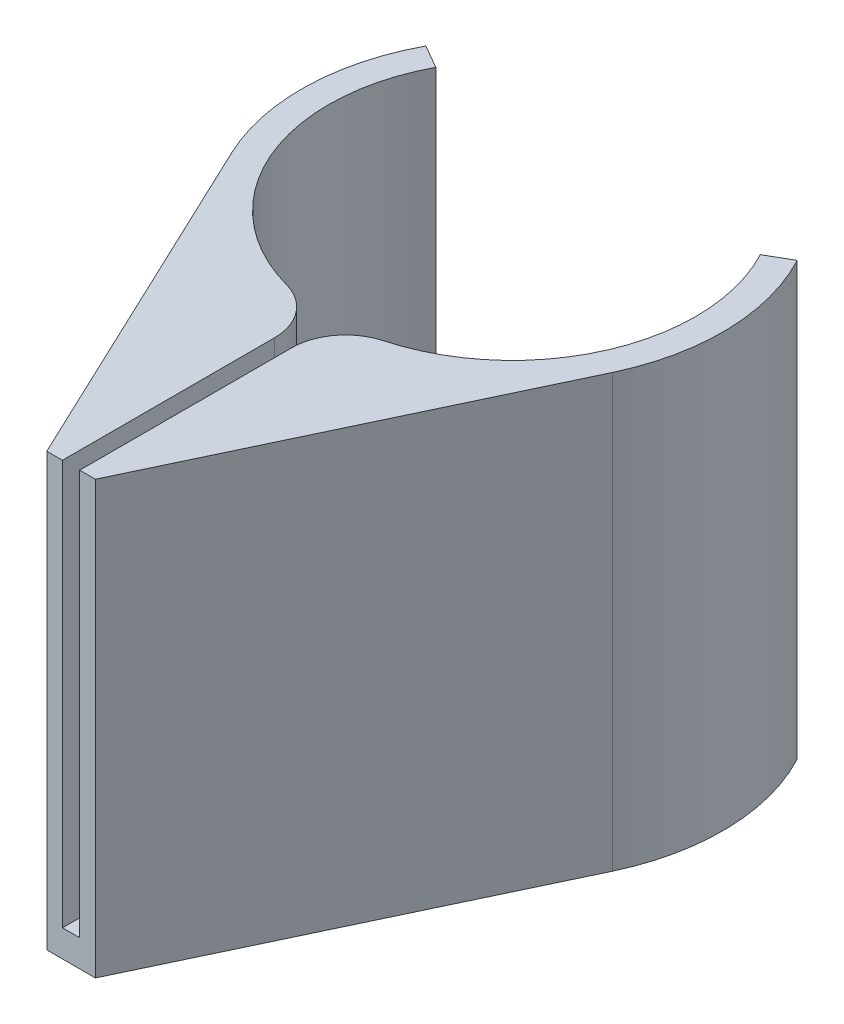
ISO-10303-21;
HEADER;
FILE_DESCRIPTION(('STEP AP214'),'2;1');
FILE_NAME('part.step','',(''),(''),'','','');
FILE_SCHEMA(('AUTOMOTIVE_DESIGN { 1 0 10303 214 1 1 1 1 }'));
ENDSEC;
DATA;
#1=APPLICATION_CONTEXT('core data for automotive mechanical design processes');
#2=APPLICATION_PROTOCOL_DEFINITION('international standard','automotive_design',2000,#1);
#3=PRODUCT_CONTEXT('',#1,'mechanical');
#4=PRODUCT('Part','Part','',(#3));
#5=PRODUCT_RELATED_PRODUCT_CATEGORY('part','',(#4));
#6=PRODUCT_DEFINITION_FORMATION('','',#4);
#7=PRODUCT_DEFINITION_CONTEXT('part definition',#1,'design');
#8=PRODUCT_DEFINITION('design','',#6,#7);
#9=PRODUCT_DEFINITION_SHAPE('','',#8);
#10=(LENGTH_UNIT() NAMED_UNIT(*) SI_UNIT(.MILLI.,.METRE.));
#11=(NAMED_UNIT(*) PLANE_ANGLE_UNIT() SI_UNIT($,.RADIAN.));
#12=(NAMED_UNIT(*) SI_UNIT($,.STERADIAN.) SOLID_ANGLE_UNIT());
#13=UNCERTAINTY_MEASURE_WITH_UNIT(LENGTH_MEASURE(1.E-05),#10,'distance_accuracy_value','');
#14=(GEOMETRIC_REPRESENTATION_CONTEXT(3) GLOBAL_UNCERTAINTY_ASSIGNED_CONTEXT((#13)) GLOBAL_UNIT_ASSIGNED_CONTEXT((#10,
#11,#12)) REPRESENTATION_CONTEXT('',''));
#15=CARTESIAN_POINT('',(0.,0.,0.));
#16=DIRECTION('',(0.,0.,1.));
#17=DIRECTION('',(1.,0.,0.));
#18=AXIS2_PLACEMENT_3D('',#15,#16,#17);
#19=CARTESIAN_POINT('',(0.,80.,0.));
#20=DIRECTION('',(0.,-1.,0.));
#21=DIRECTION('',(0.,0.,-1.));
#22=AXIS2_PLACEMENT_3D('',#19,#20,#21);
#23=CYLINDRICAL_SURFACE('',#22,34.);
#24=CARTESIAN_POINT('',(0.,0.,0.));
#25=DIRECTION('',(0.,1.,0.));
#26=DIRECTION('',(0.,0.,1.));
#27=AXIS2_PLACEMENT_3D('',#24,#25,#26);
#28=CIRCLE('',#27,34.);
#29=CARTESIAN_POINT('',(8.96363636363636,0.,32.797152668189));
#30=VERTEX_POINT('',#29);
#31=CARTESIAN_POINT('',(30.0499575190857,0.,-15.9059753898071));
#32=VERTEX_POINT('',#31);
#33=EDGE_CURVE('E218',#30,#32,#28,.T.);
#34=ORIENTED_EDGE('',*,*,#33,.F.);
#35=DIRECTION('',(0.,-1.,0.));
#36=VECTOR('',#35,1.);
#37=CARTESIAN_POINT('',(8.96363636363636,80.,32.797152668189));
#38=LINE('',#37,#36);
#39=CARTESIAN_POINT('',(8.96363636363636,80.,32.797152668189));
#40=VERTEX_POINT('',#39);
#41=EDGE_CURVE('E276',#30,#40,#38,.F.);
#42=ORIENTED_EDGE('',*,*,#41,.T.);
#43=CARTESIAN_POINT('',(0.,80.,0.));
#44=DIRECTION('',(0.,1.,0.));
#45=DIRECTION('',(0.,0.,1.));
#46=AXIS2_PLACEMENT_3D('',#43,#44,#45);
#47=CIRCLE('',#46,34.);
#48=CARTESIAN_POINT('',(30.0499575190857,80.,-15.9059753898071));
#49=VERTEX_POINT('',#48);
#50=EDGE_CURVE('E346',#40,#49,#47,.T.);
#51=ORIENTED_EDGE('',*,*,#50,.T.);
#52=DIRECTION('',(0.,-1.,0.));
#53=VECTOR('',#52,1.);
#54=CARTESIAN_POINT('',(30.0499575190857,80.,-15.9059753898071));
#55=LINE('',#54,#53);
#56=EDGE_CURVE('E249',#49,#32,#55,.T.);
#57=ORIENTED_EDGE('',*,*,#56,.T.);
#58=EDGE_LOOP('',(#34,#42,#51,#57));
#59=FACE_BOUND('',#58,.T.);
#60=ADVANCED_FACE('F43',(#59),#23,.F.);
#61=CARTESIAN_POINT('',(0.,80.,0.));
#62=DIRECTION('',(0.,1.,0.));
#63=DIRECTION('',(0.,0.,1.));
#64=AXIS2_PLACEMENT_3D('',#61,#62,#63);
#65=PLANE('',#64);
#66=DIRECTION('',(0.,0.,1.));
#67=VECTOR('',#66,1.);
#68=CARTESIAN_POINT('',(-1.6,80.,81.685));
#69=LINE('',#68,#67);
#70=CARTESIAN_POINT('',(-1.6,80.,42.4433740411858));
#71=VERTEX_POINT('',#70);
#72=CARTESIAN_POINT('',(-1.6,80.,81.685));
#73=VERTEX_POINT('',#72);
#74=EDGE_CURVE('E166',#71,#73,#69,.T.);
#75=ORIENTED_EDGE('',*,*,#74,.F.);
#76=CARTESIAN_POINT('',(-11.6,80.,42.4433740411858));
#77=DIRECTION('',(0.,1.,0.));
#78=DIRECTION('',(0.,0.,1.));
#79=AXIS2_PLACEMENT_3D('',#76,#77,#78);
#80=CIRCLE('',#79,10.);
#81=CARTESIAN_POINT('',(-8.96363636363636,80.,32.797152668189));
#82=VERTEX_POINT('',#81);
#83=EDGE_CURVE('E286',#71,#82,#80,.T.);
#84=ORIENTED_EDGE('',*,*,#83,.T.);
#85=CARTESIAN_POINT('',(-30.0499575190857,80.,-15.9059753898071));
#86=VERTEX_POINT('',#85);
#87=EDGE_CURVE('E347',#86,#82,#47,.T.);
#88=ORIENTED_EDGE('',*,*,#87,.F.);
#89=DIRECTION('',(-0.866025403784436,0.,-0.500000000000004));
#90=VECTOR('',#89,1.);
#91=CARTESIAN_POINT('',(-0.625000000000009,80.,1.08253175473055));
#92=LINE('',#91,#90);
#93=CARTESIAN_POINT('',(-34.3826380246011,80.,-18.4074496459791));
#94=VERTEX_POINT('',#93);
#95=EDGE_CURVE('E351',#86,#94,#92,.T.);
#96=ORIENTED_EDGE('',*,*,#95,.T.);
#97=CARTESIAN_POINT('',(0.,80.,0.));
#98=DIRECTION('',(0.,1.,0.));
#99=DIRECTION('',(0.,0.,1.));
#100=AXIS2_PLACEMENT_3D('',#97,#98,#99);
#101=CIRCLE('',#100,39.);
#102=CARTESIAN_POINT('',(-35.2539104463336,80.,16.6781833016037));
#103=VERTEX_POINT('',#102);
#104=EDGE_CURVE('E353',#94,#103,#101,.T.);
#105=ORIENTED_EDGE('',*,*,#104,.T.);
#106=DIRECTION('',(0.427645725682146,0.,0.903946421700861));
#107=VECTOR('',#106,1.);
#108=CARTESIAN_POINT('',(-35.2539104463336,80.,16.6781833016037));
#109=LINE('',#108,#107);
#110=CARTESIAN_POINT('',(-4.50000000000001,80.,81.685));
#111=VERTEX_POINT('',#110);
#112=EDGE_CURVE('E191',#103,#111,#109,.T.);
#113=ORIENTED_EDGE('',*,*,#112,.T.);
#114=DIRECTION('',(1.,0.,0.));
#115=VECTOR('',#114,1.);
#116=CARTESIAN_POINT('',(0.,80.,81.685));
#117=LINE('',#116,#115);
#118=EDGE_CURVE('E182',#111,#73,#117,.T.);
#119=ORIENTED_EDGE('',*,*,#118,.T.);
#120=EDGE_LOOP('',(#75,#84,#88,#96,#105,#113,#119));
#121=FACE_BOUND('',#120,.T.);
#122=ADVANCED_FACE('F189',(#121),#65,.T.);
#123=CARTESIAN_POINT('',(35.2539104463336,80.,16.6781833016037));
#124=DIRECTION('',(-0.903946421700861,0.,-0.427645725682146));
#125=DIRECTION('',(-0.427645725682146,0.,0.903946421700861));
#126=AXIS2_PLACEMENT_3D('',#123,#124,#125);
#127=PLANE('',#126);
#128=DIRECTION('',(0.427645725682146,0.,-0.903946421700861));
#129=VECTOR('',#128,1.);
#130=CARTESIAN_POINT('',(35.2539104463336,0.,16.6781833016037));
#131=LINE('',#130,#129);
#132=CARTESIAN_POINT('',(4.5,0.,81.685));
#133=VERTEX_POINT('',#132);
#134=CARTESIAN_POINT('',(35.2539104463336,0.,16.6781833016037));
#135=VERTEX_POINT('',#134);
#136=EDGE_CURVE('E205',#133,#135,#131,.T.);
#137=ORIENTED_EDGE('',*,*,#136,.T.);
#138=DIRECTION('',(0.,-1.,0.));
#139=VECTOR('',#138,1.);
#140=CARTESIAN_POINT('',(35.2539104463336,80.,16.6781833016037));
#141=LINE('',#140,#139);
#142=CARTESIAN_POINT('',(35.2539104463336,80.,16.6781833016037));
#143=VERTEX_POINT('',#142);
#144=EDGE_CURVE('E256',#143,#135,#141,.T.);
#145=ORIENTED_EDGE('',*,*,#144,.F.);
#146=DIRECTION('',(0.427645725682146,0.,-0.903946421700861));
#147=VECTOR('',#146,1.);
#148=CARTESIAN_POINT('',(35.2539104463336,80.,16.6781833016037));
#149=LINE('',#148,#147);
#150=CARTESIAN_POINT('',(4.5,80.,81.685));
#151=VERTEX_POINT('',#150);
#152=EDGE_CURVE('E234',#151,#143,#149,.T.);
#153=ORIENTED_EDGE('',*,*,#152,.F.);
#154=DIRECTION('',(0.,-1.,0.));
#155=VECTOR('',#154,1.);
#156=CARTESIAN_POINT('',(4.5,80.,81.685));
#157=LINE('',#156,#155);
#158=EDGE_CURVE('E194',#151,#133,#157,.T.);
#159=ORIENTED_EDGE('',*,*,#158,.T.);
#160=EDGE_LOOP('',(#137,#145,#153,#159));
#161=FACE_BOUND('',#160,.T.);
#162=ADVANCED_FACE('F309',(#161),#127,.F.);
#163=CARTESIAN_POINT('',(0.,80.,0.));
#164=DIRECTION('',(0.,-1.,0.));
#165=DIRECTION('',(0.,0.,-1.));
#166=AXIS2_PLACEMENT_3D('',#163,#164,#165);
#167=CYLINDRICAL_SURFACE('',#166,39.);
#168=CARTESIAN_POINT('',(0.,0.,0.));
#169=DIRECTION('',(0.,1.,0.));
#170=DIRECTION('',(0.,0.,1.));
#171=AXIS2_PLACEMENT_3D('',#168,#169,#170);
#172=CIRCLE('',#171,39.);
#173=CARTESIAN_POINT('',(34.3826380246011,0.,-18.4074496459791));
#174=VERTEX_POINT('',#173);
#175=EDGE_CURVE('E209',#135,#174,#172,.T.);
#176=ORIENTED_EDGE('',*,*,#175,.T.);
#177=DIRECTION('',(0.,-1.,0.));
#178=VECTOR('',#177,1.);
#179=CARTESIAN_POINT('',(34.3826380246011,80.,-18.4074496459791));
#180=LINE('',#179,#178);
#181=CARTESIAN_POINT('',(34.3826380246011,80.,-18.4074496459791));
#182=VERTEX_POINT('',#181);
#183=EDGE_CURVE('E253',#182,#174,#180,.T.);
#184=ORIENTED_EDGE('',*,*,#183,.F.);
#185=CARTESIAN_POINT('',(0.,80.,0.));
#186=DIRECTION('',(0.,1.,0.));
#187=DIRECTION('',(0.,0.,1.));
#188=AXIS2_PLACEMENT_3D('',#185,#186,#187);
#189=CIRCLE('',#188,39.);
#190=EDGE_CURVE('E339',#143,#182,#189,.T.);
#191=ORIENTED_EDGE('',*,*,#190,.F.);
#192=ORIENTED_EDGE('',*,*,#144,.T.);
#193=EDGE_LOOP('',(#176,#184,#191,#192));
#194=FACE_BOUND('',#193,.T.);
#195=ADVANCED_FACE('F400',(#194),#167,.T.);
#196=CARTESIAN_POINT('',(0.625000000000009,80.,1.08253175473055));
#197=DIRECTION('',(-0.500000000000004,0.,-0.866025403784436));
#198=DIRECTION('',(-0.866025403784436,0.,0.500000000000004));
#199=AXIS2_PLACEMENT_3D('',#196,#197,#198);
#200=PLANE('',#199);
#201=DIRECTION('',(0.866025403784436,0.,-0.500000000000004));
#202=VECTOR('',#201,1.);
#203=CARTESIAN_POINT('',(0.625000000000009,0.,1.08253175473055));
#204=LINE('',#203,#202);
#205=EDGE_CURVE('E214',#32,#174,#204,.T.);
#206=ORIENTED_EDGE('',*,*,#205,.F.);
#207=ORIENTED_EDGE('',*,*,#56,.F.);
#208=DIRECTION('',(0.866025403784436,0.,-0.500000000000004));
#209=VECTOR('',#208,1.);
#210=CARTESIAN_POINT('',(0.625000000000009,80.,1.08253175473055));
#211=LINE('',#210,#209);
#212=EDGE_CURVE('E342',#49,#182,#211,.T.);
#213=ORIENTED_EDGE('',*,*,#212,.T.);
#214=ORIENTED_EDGE('',*,*,#183,.T.);
#215=EDGE_LOOP('',(#206,#207,#213,#214));
#216=FACE_BOUND('',#215,.T.);
#217=ADVANCED_FACE('F397',(#216),#200,.T.);
#218=ORIENTED_EDGE('',*,*,#87,.T.);
#219=DIRECTION('',(0.,-1.,0.));
#220=VECTOR('',#219,1.);
#221=CARTESIAN_POINT('',(-8.96363636363636,80.,32.797152668189));
#222=LINE('',#221,#220);
#223=CARTESIAN_POINT('',(-8.96363636363636,0.,32.797152668189));
#224=VERTEX_POINT('',#223);
#225=EDGE_CURVE('E273',#82,#224,#222,.T.);
#226=ORIENTED_EDGE('',*,*,#225,.T.);
#227=CARTESIAN_POINT('',(-30.0499575190857,0.,-15.9059753898071));
#228=VERTEX_POINT('',#227);
#229=EDGE_CURVE('E219',#228,#224,#28,.T.);
#230=ORIENTED_EDGE('',*,*,#229,.F.);
#231=DIRECTION('',(0.,-1.,0.));
#232=VECTOR('',#231,1.);
#233=CARTESIAN_POINT('',(-30.0499575190857,80.,-15.9059753898071));
#234=LINE('',#233,#232);
#235=EDGE_CURVE('E246',#86,#228,#234,.T.);
#236=ORIENTED_EDGE('',*,*,#235,.F.);
#237=EDGE_LOOP('',(#218,#226,#230,#236));
#238=FACE_BOUND('',#237,.T.);
#239=ADVANCED_FACE('F413',(#238),#23,.F.);
#240=CARTESIAN_POINT('',(-0.625000000000009,80.,1.08253175473055));
#241=DIRECTION('',(-0.500000000000004,0.,0.866025403784436));
#242=DIRECTION('',(0.866025403784436,0.,0.500000000000004));
#243=AXIS2_PLACEMENT_3D('',#240,#241,#242);
#244=PLANE('',#243);
#245=DIRECTION('',(-0.866025403784436,0.,-0.500000000000004));
#246=VECTOR('',#245,1.);
#247=CARTESIAN_POINT('',(-0.625000000000009,0.,1.08253175473055));
#248=LINE('',#247,#246);
#249=CARTESIAN_POINT('',(-34.3826380246011,0.,-18.4074496459791));
#250=VERTEX_POINT('',#249);
#251=EDGE_CURVE('E223',#228,#250,#248,.T.);
#252=ORIENTED_EDGE('',*,*,#251,.T.);
#253=DIRECTION('',(0.,-1.,0.));
#254=VECTOR('',#253,1.);
#255=CARTESIAN_POINT('',(-34.3826380246011,80.,-18.4074496459791));
#256=LINE('',#255,#254);
#257=EDGE_CURVE('E242',#94,#250,#256,.T.);
#258=ORIENTED_EDGE('',*,*,#257,.F.);
#259=ORIENTED_EDGE('',*,*,#95,.F.);
#260=ORIENTED_EDGE('',*,*,#235,.T.);
#261=EDGE_LOOP('',(#252,#258,#259,#260));
#262=FACE_BOUND('',#261,.T.);
#263=ADVANCED_FACE('F420',(#262),#244,.F.);
#264=CARTESIAN_POINT('',(0.,80.,0.));
#265=DIRECTION('',(0.,-1.,0.));
#266=DIRECTION('',(0.,0.,-1.));
#267=AXIS2_PLACEMENT_3D('',#264,#265,#266);
#268=CYLINDRICAL_SURFACE('',#267,39.);
#269=CARTESIAN_POINT('',(0.,0.,0.));
#270=DIRECTION('',(0.,1.,0.));
#271=DIRECTION('',(0.,0.,1.));
#272=AXIS2_PLACEMENT_3D('',#269,#270,#271);
#273=CIRCLE('',#272,39.);
#274=CARTESIAN_POINT('',(-35.2539104463336,0.,16.6781833016037));
#275=VERTEX_POINT('',#274);
#276=EDGE_CURVE('E226',#250,#275,#273,.T.);
#277=ORIENTED_EDGE('',*,*,#276,.T.);
#278=DIRECTION('',(0.,-1.,0.));
#279=VECTOR('',#278,1.);
#280=CARTESIAN_POINT('',(-35.2539104463336,80.,16.6781833016037));
#281=LINE('',#280,#279);
#282=EDGE_CURVE('E238',#103,#275,#281,.T.);
#283=ORIENTED_EDGE('',*,*,#282,.F.);
#284=ORIENTED_EDGE('',*,*,#104,.F.);
#285=ORIENTED_EDGE('',*,*,#257,.T.);
#286=EDGE_LOOP('',(#277,#283,#284,#285));
#287=FACE_BOUND('',#286,.T.);
#288=ADVANCED_FACE('F362',(#287),#268,.T.);
#289=CARTESIAN_POINT('',(-35.2539104463336,80.,16.6781833016037));
#290=DIRECTION('',(0.903946421700861,0.,-0.427645725682146));
#291=DIRECTION('',(-0.427645725682146,0.,-0.903946421700861));
#292=AXIS2_PLACEMENT_3D('',#289,#290,#291);
#293=PLANE('',#292);
#294=DIRECTION('',(0.427645725682146,0.,0.903946421700861));
#295=VECTOR('',#294,1.);
#296=CARTESIAN_POINT('',(-35.2539104463336,0.,16.6781833016037));
#297=LINE('',#296,#295);
#298=CARTESIAN_POINT('',(-4.50000000000001,0.,81.685));
#299=VERTEX_POINT('',#298);
#300=EDGE_CURVE('E229',#275,#299,#297,.T.);
#301=ORIENTED_EDGE('',*,*,#300,.T.);
#302=DIRECTION('',(0.,-1.,0.));
#303=VECTOR('',#302,1.);
#304=CARTESIAN_POINT('',(-4.50000000000001,80.,81.685));
#305=LINE('',#304,#303);
#306=EDGE_CURVE('E200',#111,#299,#305,.T.);
#307=ORIENTED_EDGE('',*,*,#306,.F.);
#308=ORIENTED_EDGE('',*,*,#112,.F.);
#309=ORIENTED_EDGE('',*,*,#282,.T.);
#310=EDGE_LOOP('',(#301,#307,#308,#309));
#311=FACE_BOUND('',#310,.T.);
#312=ADVANCED_FACE('F366',(#311),#293,.F.);
#313=CARTESIAN_POINT('',(0.,80.,81.685));
#314=DIRECTION('',(0.,0.,-1.));
#315=DIRECTION('',(-1.,0.,0.));
#316=AXIS2_PLACEMENT_3D('',#313,#314,#315);
#317=PLANE('',#316);
#318=DIRECTION('',(-1.,0.,0.));
#319=VECTOR('',#318,1.);
#320=CARTESIAN_POINT('',(-1.6,5.,81.685));
#321=LINE('',#320,#319);
#322=CARTESIAN_POINT('',(1.6,5.,81.685));
#323=VERTEX_POINT('',#322);
#324=CARTESIAN_POINT('',(-1.6,5.,81.685));
#325=VERTEX_POINT('',#324);
#326=EDGE_CURVE('E185',#323,#325,#321,.T.);
#327=ORIENTED_EDGE('',*,*,#326,.T.);
#328=DIRECTION('',(0.,1.,0.));
#329=VECTOR('',#328,1.);
#330=CARTESIAN_POINT('',(-1.6,-47.8298341398053,81.685));
#331=LINE('',#330,#329);
#332=EDGE_CURVE('E170',#325,#73,#331,.T.);
#333=ORIENTED_EDGE('',*,*,#332,.T.);
#334=ORIENTED_EDGE('',*,*,#118,.F.);
#335=ORIENTED_EDGE('',*,*,#306,.T.);
#336=DIRECTION('',(1.,0.,0.));
#337=VECTOR('',#336,1.);
#338=CARTESIAN_POINT('',(0.,0.,81.685));
#339=LINE('',#338,#337);
#340=EDGE_CURVE('E232',#299,#133,#339,.T.);
#341=ORIENTED_EDGE('',*,*,#340,.T.);
#342=ORIENTED_EDGE('',*,*,#158,.F.);
#343=CARTESIAN_POINT('',(1.6,80.,81.685));
#344=VERTEX_POINT('',#343);
#345=EDGE_CURVE('E195',#344,#151,#117,.T.);
#346=ORIENTED_EDGE('',*,*,#345,.F.);
#347=DIRECTION('',(0.,1.,0.));
#348=VECTOR('',#347,1.);
#349=CARTESIAN_POINT('',(1.6,-47.8298341398053,81.685));
#350=LINE('',#349,#348);
#351=EDGE_CURVE('E175',#323,#344,#350,.T.);
#352=ORIENTED_EDGE('',*,*,#351,.F.);
#353=EDGE_LOOP('',(#327,#333,#334,#335,#341,#342,#346,#352));
#354=FACE_BOUND('',#353,.T.);
#355=ADVANCED_FACE('F180',(#354),#317,.F.);
#356=ORIENTED_EDGE('',*,*,#50,.F.);
#357=CARTESIAN_POINT('',(11.6,80.,42.4433740411858));
#358=DIRECTION('',(0.,1.,0.));
#359=DIRECTION('',(0.,0.,1.));
#360=AXIS2_PLACEMENT_3D('',#357,#358,#359);
#361=CIRCLE('',#360,10.);
#362=CARTESIAN_POINT('',(1.6,80.,42.4433740411858));
#363=VERTEX_POINT('',#362);
#364=EDGE_CURVE('E279',#40,#363,#361,.T.);
#365=ORIENTED_EDGE('',*,*,#364,.T.);
#366=DIRECTION('',(0.,0.,-1.));
#367=VECTOR('',#366,1.);
#368=CARTESIAN_POINT('',(1.6,80.,81.685));
#369=LINE('',#368,#367);
#370=EDGE_CURVE('E176',#344,#363,#369,.T.);
#371=ORIENTED_EDGE('',*,*,#370,.F.);
#372=ORIENTED_EDGE('',*,*,#345,.T.);
#373=ORIENTED_EDGE('',*,*,#152,.T.);
#374=ORIENTED_EDGE('',*,*,#190,.T.);
#375=ORIENTED_EDGE('',*,*,#212,.F.);
#376=EDGE_LOOP('',(#356,#365,#371,#372,#373,#374,#375));
#377=FACE_BOUND('',#376,.T.);
#378=ADVANCED_FACE('F378',(#377),#65,.T.);
#379=CARTESIAN_POINT('',(0.,0.,0.));
#380=DIRECTION('',(0.,1.,0.));
#381=DIRECTION('',(0.,0.,1.));
#382=AXIS2_PLACEMENT_3D('',#379,#380,#381);
#383=PLANE('',#382);
#384=CARTESIAN_POINT('',(0.,0.,0.));
#385=DIRECTION('',(0.,1.,0.));
#386=DIRECTION('',(0.,0.,1.));
#387=AXIS2_PLACEMENT_3D('',#384,#385,#386);
#388=CIRCLE('',#387,35.3397459621556);
#389=CARTESIAN_POINT('',(-4.92816498885237,0.,34.9944400514108));
#390=VERTEX_POINT('',#389);
#391=CARTESIAN_POINT('',(4.92816498885347,0.,34.9944400514186));
#392=VERTEX_POINT('',#391);
#393=EDGE_CURVE('E263',#390,#392,#388,.T.);
#394=ORIENTED_EDGE('',*,*,#393,.T.);
#395=CARTESIAN_POINT('',(11.6,0.,42.4433740411858));
#396=DIRECTION('',(0.,1.,0.));
#397=DIRECTION('',(0.,0.,1.));
#398=AXIS2_PLACEMENT_3D('',#395,#396,#397);
#399=CIRCLE('',#398,10.);
#400=EDGE_CURVE('E266',#392,#30,#399,.F.);
#401=ORIENTED_EDGE('',*,*,#400,.T.);
#402=ORIENTED_EDGE('',*,*,#33,.T.);
#403=ORIENTED_EDGE('',*,*,#205,.T.);
#404=ORIENTED_EDGE('',*,*,#175,.F.);
#405=ORIENTED_EDGE('',*,*,#136,.F.);
#406=ORIENTED_EDGE('',*,*,#340,.F.);
#407=ORIENTED_EDGE('',*,*,#300,.F.);
#408=ORIENTED_EDGE('',*,*,#276,.F.);
#409=ORIENTED_EDGE('',*,*,#251,.F.);
#410=ORIENTED_EDGE('',*,*,#229,.T.);
#411=CARTESIAN_POINT('',(-11.6,0.,42.4433740411858));
#412=DIRECTION('',(0.,1.,0.));
#413=DIRECTION('',(0.,0.,1.));
#414=AXIS2_PLACEMENT_3D('',#411,#412,#413);
#415=CIRCLE('',#414,10.);
#416=EDGE_CURVE('E260',#224,#390,#415,.F.);
#417=ORIENTED_EDGE('',*,*,#416,.T.);
#418=EDGE_LOOP('',(#394,#401,#402,#403,#404,#405,#406,#407,#408,#409,#410,#417));
#419=FACE_BOUND('',#418,.T.);
#420=ADVANCED_FACE('F371',(#419),#383,.F.);
#421=CARTESIAN_POINT('',(-1.6,-47.8298341398053,81.685));
#422=DIRECTION('',(-1.,0.,0.));
#423=DIRECTION('',(0.,0.,1.));
#424=AXIS2_PLACEMENT_3D('',#421,#422,#423);
#425=PLANE('',#424);
#426=CARTESIAN_POINT('',(-1.6,5.,43.9708994677162));
#427=CARTESIAN_POINT('',(-1.6,4.99997098898346,43.7148155740385));
#428=CARTESIAN_POINT('',(-1.6,4.99019034952841,43.4594798371071));
#429=CARTESIAN_POINT('',(-1.6,4.9511258151454,42.9503046950378));
#430=CARTESIAN_POINT('',(-1.6,4.92184192161945,42.6964652897925));
#431=CARTESIAN_POINT('',(-1.6,4.88280640105699,42.4433740411858));
#432=B_SPLINE_CURVE_WITH_KNOTS('',3,(#426,#427,#428,#429,#430,#431),.UNSPECIFIED.,.F.,.F.,(4,2,
4),(0.,0.766568976128166,1.5331378971511),.UNSPECIFIED.);
#433=CARTESIAN_POINT('',(-1.6,5.,43.9708994677162));
#434=VERTEX_POINT('',#433);
#435=CARTESIAN_POINT('',(-1.6,4.88280640105699,42.4433740411858));
#436=VERTEX_POINT('',#435);
#437=EDGE_CURVE('E12',#434,#436,#432,.T.);
#438=ORIENTED_EDGE('',*,*,#437,.T.);
#439=DIRECTION('',(0.,1.,0.));
#440=VECTOR('',#439,1.);
#441=CARTESIAN_POINT('',(-1.6,80.,42.4433740411858));
#442=LINE('',#441,#440);
#443=EDGE_CURVE('E67',#436,#71,#442,.T.);
#444=ORIENTED_EDGE('',*,*,#443,.T.);
#445=ORIENTED_EDGE('',*,*,#74,.T.);
#446=ORIENTED_EDGE('',*,*,#332,.F.);
#447=DIRECTION('',(0.,0.,-1.));
#448=VECTOR('',#447,1.);
#449=CARTESIAN_POINT('',(-1.6,5.,81.685));
#450=LINE('',#449,#448);
#451=EDGE_CURVE('E187',#325,#434,#450,.T.);
#452=ORIENTED_EDGE('',*,*,#451,.T.);
#453=EDGE_LOOP('',(#438,#444,#445,#446,#452));
#454=FACE_BOUND('',#453,.T.);
#455=ADVANCED_FACE('F168',(#454),#425,.F.);
#456=CARTESIAN_POINT('',(1.6,-47.8298341398053,81.685));
#457=DIRECTION('',(1.,0.,0.));
#458=DIRECTION('',(0.,0.,-1.));
#459=AXIS2_PLACEMENT_3D('',#456,#457,#458);
#460=PLANE('',#459);
#461=ORIENTED_EDGE('',*,*,#370,.T.);
#462=DIRECTION('',(0.,1.,0.));
#463=VECTOR('',#462,1.);
#464=CARTESIAN_POINT('',(1.6,4.99999999999999,42.4433740411858));
#465=LINE('',#464,#463);
#466=CARTESIAN_POINT('',(1.6,4.88280640105699,42.4433740411858));
#467=VERTEX_POINT('',#466);
#468=EDGE_CURVE('E74',#363,#467,#465,.F.);
#469=ORIENTED_EDGE('',*,*,#468,.T.);
#470=CARTESIAN_POINT('',(1.6,4.88280640105699,42.4433740411858));
#471=CARTESIAN_POINT('',(1.6,4.92184192161945,42.6964652897925));
#472=CARTESIAN_POINT('',(1.6,4.9511258151454,42.9503046950378));
#473=CARTESIAN_POINT('',(1.6,4.99019034952841,43.4594798371071));
#474=CARTESIAN_POINT('',(1.6,4.99997098898345,43.7148155740385));
#475=CARTESIAN_POINT('',(1.6,4.99999999999999,43.9708994677162));
#476=B_SPLINE_CURVE_WITH_KNOTS('',3,(#470,#471,#472,#473,#474,#475),.UNSPECIFIED.,.F.,.F.,(4,2,
4),(0.,0.76656892102293,1.5331378971511),.UNSPECIFIED.);
#477=CARTESIAN_POINT('',(1.6,5.,43.9708994677162));
#478=VERTEX_POINT('',#477);
#479=EDGE_CURVE('E59',#467,#478,#476,.T.);
#480=ORIENTED_EDGE('',*,*,#479,.T.);
#481=DIRECTION('',(0.,0.,1.));
#482=VECTOR('',#481,1.);
#483=CARTESIAN_POINT('',(1.6,5.,81.685));
#484=LINE('',#483,#482);
#485=EDGE_CURVE('E210',#478,#323,#484,.T.);
#486=ORIENTED_EDGE('',*,*,#485,.T.);
#487=ORIENTED_EDGE('',*,*,#351,.T.);
#488=EDGE_LOOP('',(#461,#469,#480,#486,#487));
#489=FACE_BOUND('',#488,.T.);
#490=ADVANCED_FACE('F300',(#489),#460,.F.);
#491=CARTESIAN_POINT('',(0.,5.,0.));
#492=DIRECTION('',(0.,1.,0.));
#493=DIRECTION('',(0.,0.,1.));
#494=AXIS2_PLACEMENT_3D('',#491,#492,#493);
#495=PLANE('',#494);
#496=ORIENTED_EDGE('',*,*,#485,.F.);
#497=CARTESIAN_POINT('',(0.,5.,0.));
#498=DIRECTION('',(0.,1.,0.));
#499=DIRECTION('',(0.,0.,1.));
#500=AXIS2_PLACEMENT_3D('',#497,#498,#499);
#501=CIRCLE('',#500,44.);
#502=EDGE_CURVE('E269',#478,#434,#501,.F.);
#503=ORIENTED_EDGE('',*,*,#502,.T.);
#504=ORIENTED_EDGE('',*,*,#451,.F.);
#505=ORIENTED_EDGE('',*,*,#326,.F.);
#506=EDGE_LOOP('',(#496,#503,#504,#505));
#507=FACE_BOUND('',#506,.T.);
#508=ADVANCED_FACE('F387',(#507),#495,.T.);
#509=CARTESIAN_POINT('',(-11.6,80.,42.4433740411858));
#510=DIRECTION('',(0.,-1.,0.));
#511=DIRECTION('',(0.,0.,-1.));
#512=AXIS2_PLACEMENT_3D('',#509,#510,#511);
#513=CYLINDRICAL_SURFACE('',#512,10.);
#514=ORIENTED_EDGE('',*,*,#443,.F.);
#515=CARTESIAN_POINT('',(-8.96363636363636,-5.,32.797152668189));
#516=CARTESIAN_POINT('',(-8.95939060102163,-4.99499290817184,32.7983130649477));
#517=CARTESIAN_POINT('',(-8.95514558023159,-4.98998578996363,32.7994762640892));
#518=CARTESIAN_POINT('',(-8.56255176797866,-4.52682745378346,32.9073309118515));
#519=CARTESIAN_POINT('',(-8.18042164025167,-4.06848272327391,33.0374840707654));
#520=CARTESIAN_POINT('',(-7.42985252367336,-3.15598743507233,33.3453168097569));
#521=CARTESIAN_POINT('',(-7.06142642813644,-2.70184111487526,33.5230399186667));
#522=CARTESIAN_POINT('',(-6.34009463267574,-1.80243591527148,33.9284045928461));
#523=CARTESIAN_POINT('',(-5.98720332755883,-1.3571854792086,34.1560913330554));
#524=CARTESIAN_POINT('',(-5.47281933945912,-0.701364961358311,34.5374856759609));
#525=CARTESIAN_POINT('',(-5.30391095183194,-0.484846560487416,34.6712033275476));
#526=CARTESIAN_POINT('',(-4.97160481803496,-0.056602243511141,34.9525926357133));
#527=CARTESIAN_POINT('',(-4.80820764246926,0.15512317561051,35.1002657311902));
#528=CARTESIAN_POINT('',(-4.47958700263967,0.583324474121336,35.4180909458943));
#529=CARTESIAN_POINT('',(-4.31469584443203,0.799491417513484,35.5890056226493));
#530=CARTESIAN_POINT('',(-3.99317205290233,1.22377423774918,35.9476712448342));
#531=CARTESIAN_POINT('',(-3.83653709122659,1.43189238000171,36.1354174027926));
#532=CARTESIAN_POINT('',(-3.53320557353226,1.83810401271522,36.5282806175706));
#533=CARTESIAN_POINT('',(-3.38649530018161,2.03621123966472,36.7333727787851));
#534=CARTESIAN_POINT('',(-3.10466371629398,2.42062579103741,37.161804305974));
#535=CARTESIAN_POINT('',(-2.96954024177399,2.60693531712489,37.385140249408));
#536=CARTESIAN_POINT('',(-2.73774500196447,2.93097192326777,37.8058600758496));
#537=CARTESIAN_POINT('',(-2.63866659092628,3.07116745649648,38.0000164975448));
#538=CARTESIAN_POINT('',(-2.45101121956777,3.34077338453973,38.4004938906866));
#539=CARTESIAN_POINT('',(-2.36243170600383,3.47018639928873,38.6068118861904));
#540=CARTESIAN_POINT('',(-2.19741728775022,3.71652705041184,39.0311590222986));
#541=CARTESIAN_POINT('',(-2.1209707581159,3.83346660228288,39.2491766817719));
#542=CARTESIAN_POINT('',(-1.98183942625555,4.05327840459391,39.6964148492459));
#543=CARTESIAN_POINT('',(-1.91915115129123,4.15615420240562,39.9256325123388));
#544=CARTESIAN_POINT('',(-1.8218307219191,4.32441446852887,40.3405499612643));
#545=CARTESIAN_POINT('',(-1.78406084117151,4.3929943074968,40.5242254754156));
#546=CARTESIAN_POINT('',(-1.71851270159132,4.52001574899757,40.8967772370656));
#547=CARTESIAN_POINT('',(-1.69073245225928,4.57845937003536,41.0856524404087));
#548=CARTESIAN_POINT('',(-1.64586189669154,4.68453175191291,41.4676184163687));
#549=CARTESIAN_POINT('',(-1.62876864272054,4.73216349262349,41.6607080113324));
#550=CARTESIAN_POINT('',(-1.60583701274833,4.81608765581071,42.0500176786297));
#551=CARTESIAN_POINT('',(-1.59999938713767,4.85237932213182,42.2462379588006));
#552=CARTESIAN_POINT('',(-1.60000065237928,4.91519539765235,42.6532213261288));
#553=CARTESIAN_POINT('',(-1.60661670761158,4.94093913500206,42.8641063214377));
#554=CARTESIAN_POINT('',(-1.63334054273107,4.97890998523666,43.286245113294));
#555=CARTESIAN_POINT('',(-1.65344877977217,4.99113664008677,43.497498922096));
#556=CARTESIAN_POINT('',(-1.70714816431533,5.00212209730521,43.9186930497877));
#557=CARTESIAN_POINT('',(-1.74074287866074,5.00087733455057,44.1286330062662));
#558=CARTESIAN_POINT('',(-1.82113107200414,4.98521969118454,44.5454631285605));
#559=CARTESIAN_POINT('',(-1.86792456186637,4.97080679973412,44.7523532918657));
#560=CARTESIAN_POINT('',(-1.97400188631158,4.92942167384862,45.1608238293153));
#561=CARTESIAN_POINT('',(-2.03324107156491,4.90249392912273,45.3624203615686));
#562=CARTESIAN_POINT('',(-2.1636096968772,4.83679750497618,45.7597362305338));
#563=CARTESIAN_POINT('',(-2.23473918665164,4.79802877604566,45.955455542668));
#564=CARTESIAN_POINT('',(-2.38806726386639,4.70946596924282,46.3399280299315));
#565=CARTESIAN_POINT('',(-2.47026623352988,4.65967151061971,46.5286809642287));
#566=CARTESIAN_POINT('',(-2.64486726458826,4.54991648172946,46.898418611121));
#567=CARTESIAN_POINT('',(-2.73727329396708,4.48995195297337,47.0794002644005));
#568=CARTESIAN_POINT('',(-2.93522427657863,4.35817878592574,47.4399343101914));
#569=CARTESIAN_POINT('',(-3.04114633722037,4.28599306158334,47.619141617572));
#570=CARTESIAN_POINT('',(-3.26199995188247,4.13257419929979,47.9679024751608));
#571=CARTESIAN_POINT('',(-3.37693490254643,4.05133764551684,48.137452343857));
#572=CARTESIAN_POINT('',(-3.73380018103946,3.79544036924058,48.6310704596592));
#573=CARTESIAN_POINT('',(-3.98787007011883,3.60853891934198,48.9402492247723));
#574=CARTESIAN_POINT('',(-4.45742763057996,3.25655020978042,49.4486220488431));
#575=CARTESIAN_POINT('',(-4.66775159624308,3.09682110716523,49.6564997230139));
#576=CARTESIAN_POINT('',(-5.10033128903248,2.76470399942364,50.0486019313782));
#577=CARTESIAN_POINT('',(-5.32259157586899,2.59231114732331,50.2328173340516));
#578=CARTESIAN_POINT('',(-5.77702143210273,2.23667807683987,50.578146112616));
#579=CARTESIAN_POINT('',(-6.0092083474066,2.05341863424441,50.7392167092307));
#580=CARTESIAN_POINT('',(-6.48099549591478,1.67814422870957,51.0383651679));
#581=CARTESIAN_POINT('',(-6.72059569154165,1.48612931014879,51.1764431464801));
#582=CARTESIAN_POINT('',(-7.58686306493184,0.786978343676697,51.6297732647279));
#583=CARTESIAN_POINT('',(-8.23039165551337,0.258591337689089,51.8826697187031));
#584=CARTESIAN_POINT('',(-9.20466780548641,-0.55529917113699,52.1581464594013));
#585=CARTESIAN_POINT('',(-9.53117730005537,-0.830366570960473,52.2326779042213));
#586=CARTESIAN_POINT('',(-10.1852862953831,-1.3863355068423,52.3483580347944));
#587=CARTESIAN_POINT('',(-10.5128855954109,-1.66723601359891,52.3895125597075));
#588=CARTESIAN_POINT('',(-11.1274470458429,-2.19917804452192,52.4363675846471));
#589=CARTESIAN_POINT('',(-11.4145547391503,-2.44974435204231,52.445738989436));
#590=CARTESIAN_POINT('',(-11.986367141314,-2.95321634887748,52.4399998275615));
#591=CARTESIAN_POINT('',(-12.2710717228176,-3.20612216070385,52.424887971497));
#592=CARTESIAN_POINT('',(-13.1185293922385,-3.96618426140388,52.3436439801506));
#593=CARTESIAN_POINT('',(-13.6761945605862,-4.47603895527321,52.241716389953));
#594=CARTESIAN_POINT('',(-14.2257858206943,-4.99010263742433,52.0924817192817));
#595=CARTESIAN_POINT('',(-14.2310753629326,-4.99505135565736,52.0910407328896));
#596=CARTESIAN_POINT('',(-14.2363636363636,-5.,52.0895954141825));
#597=B_SPLINE_CURVE_WITH_KNOTS('',3,(#515,#516,#517,#518,#519,#520,#521,#522,#523,#524,#525,
#526,#527,#528,#529,#530,#531,#532,#533,#534,#535,#536,#537,#538,#539,#540,#541,#542,#543,#544,
#545,#546,#547,#548,#549,#550,#551,#552,#553,#554,#555,#556,#557,#558,#559,#560,#561,#562,#563,
#564,#565,#566,#567,#568,#569,#570,#571,#572,#573,#574,#575,#576,#577,#578,#579,#580,#581,#582,
#583,#584,#585,#586,#587,#588,#589,#590,#591,#592,#593,#594,#595,#596),.UNSPECIFIED.,.F.,.F.,(4,
2,2,2,2,2,2,2,2,2,2,2,2,2,2,2,2,2,2,2,2,2,2,2,2,2,2,2,2,2,2,2,2,2,2,2,2,2,2,2,4),(0.,
0.0200000019000842,1.84999124307791,3.6816627746009,5.51499729796696,6.43097512381636,
7.34704749625025,8.3098673732665,9.27241425375551,10.2336023633611,11.1946105660151,
11.9714720552303,12.748144228926,13.5240676998393,14.2997950931141,14.8982670452382,
15.4966196817445,16.0948072050306,16.69303460692,17.3298353110132,17.9666575928346,
18.6036484096472,19.2406397507838,19.875383738522,20.5101303803056,21.1448989451719,
21.779915149954,22.4402658215037,23.1008665633509,24.4215594519479,25.4286545035794,
26.436137043571,27.4454584309528,28.4547747029885,31.0493893009309,32.3486887341533,
33.6477608110188,34.7904844761814,35.9332683243829,38.2126526597888,38.2348091322931),.UNSPECIFIED.);
#598=EDGE_CURVE('E48',#390,#436,#597,.T.);
#599=ORIENTED_EDGE('',*,*,#598,.F.);
#600=ORIENTED_EDGE('',*,*,#416,.F.);
#601=ORIENTED_EDGE('',*,*,#225,.F.);
#602=ORIENTED_EDGE('',*,*,#83,.F.);
#603=EDGE_LOOP('',(#514,#599,#600,#601,#602));
#604=FACE_BOUND('',#603,.T.);
#605=ADVANCED_FACE('F45',(#604),#513,.T.);
#606=CARTESIAN_POINT('',(11.6,80.,42.4433740411858));
#607=DIRECTION('',(0.,-1.,0.));
#608=DIRECTION('',(0.,0.,-1.));
#609=AXIS2_PLACEMENT_3D('',#606,#607,#608);
#610=CYLINDRICAL_SURFACE('',#609,10.);
#611=ORIENTED_EDGE('',*,*,#41,.F.);
#612=ORIENTED_EDGE('',*,*,#400,.F.);
#613=CARTESIAN_POINT('',(8.96363636363636,-5.,32.797152668189));
#614=CARTESIAN_POINT('',(8.95939060102163,-4.99499290817184,32.7983130649477));
#615=CARTESIAN_POINT('',(8.95514558023159,-4.98998578996363,32.7994762640892));
#616=CARTESIAN_POINT('',(8.56255176797866,-4.52682745378346,32.9073309118515));
#617=CARTESIAN_POINT('',(8.18042164025167,-4.06848272327391,33.0374840707654));
#618=CARTESIAN_POINT('',(7.42985252367336,-3.15598743507233,33.3453168097569));
#619=CARTESIAN_POINT('',(7.06142642813644,-2.70184111487526,33.5230399186667));
#620=CARTESIAN_POINT('',(6.34009463267574,-1.80243591527148,33.9284045928461));
#621=CARTESIAN_POINT('',(5.98720332755883,-1.3571854792086,34.1560913330554));
#622=CARTESIAN_POINT('',(5.47281933945912,-0.701364961358311,34.5374856759609));
#623=CARTESIAN_POINT('',(5.30391095183194,-0.484846560487416,34.6712033275476));
#624=CARTESIAN_POINT('',(4.97160481803496,-0.056602243511141,34.9525926357133));
#625=CARTESIAN_POINT('',(4.80820764246926,0.15512317561051,35.1002657311902));
#626=CARTESIAN_POINT('',(4.47958700263967,0.583324474121336,35.4180909458943));
#627=CARTESIAN_POINT('',(4.31469584443203,0.799491417513484,35.5890056226493));
#628=CARTESIAN_POINT('',(3.99317205290233,1.22377423774918,35.9476712448342));
#629=CARTESIAN_POINT('',(3.83653709122659,1.43189238000171,36.1354174027926));
#630=CARTESIAN_POINT('',(3.53320557353226,1.83810401271522,36.5282806175706));
#631=CARTESIAN_POINT('',(3.38649530018161,2.03621123966472,36.7333727787851));
#632=CARTESIAN_POINT('',(3.10466371629398,2.42062579103741,37.161804305974));
#633=CARTESIAN_POINT('',(2.96954024177399,2.60693531712489,37.385140249408));
#634=CARTESIAN_POINT('',(2.73774500196447,2.93097192326777,37.8058600758496));
#635=CARTESIAN_POINT('',(2.63866659092628,3.07116745649648,38.0000164975448));
#636=CARTESIAN_POINT('',(2.45101121956777,3.34077338453973,38.4004938906866));
#637=CARTESIAN_POINT('',(2.36243170600383,3.47018639928873,38.6068118861904));
#638=CARTESIAN_POINT('',(2.19741728775022,3.71652705041184,39.0311590222986));
#639=CARTESIAN_POINT('',(2.1209707581159,3.83346660228288,39.2491766817719));
#640=CARTESIAN_POINT('',(1.98183942625555,4.05327840459391,39.6964148492459));
#641=CARTESIAN_POINT('',(1.91915115129123,4.15615420240562,39.9256325123388));
#642=CARTESIAN_POINT('',(1.8218307219191,4.32441446852887,40.3405499612643));
#643=CARTESIAN_POINT('',(1.78406084117151,4.3929943074968,40.5242254754156));
#644=CARTESIAN_POINT('',(1.71851270159132,4.52001574899757,40.8967772370656));
#645=CARTESIAN_POINT('',(1.69073245225928,4.57845937003536,41.0856524404087));
#646=CARTESIAN_POINT('',(1.64586189669154,4.68453175191291,41.4676184163687));
#647=CARTESIAN_POINT('',(1.62876864272054,4.73216349262349,41.6607080113324));
#648=CARTESIAN_POINT('',(1.60583701274833,4.81608765581071,42.0500176786297));
#649=CARTESIAN_POINT('',(1.59999938713767,4.85237932213182,42.2462379588006));
#650=CARTESIAN_POINT('',(1.60000065237928,4.91519539765235,42.6532213261288));
#651=CARTESIAN_POINT('',(1.60661670761158,4.94093913500206,42.8641063214377));
#652=CARTESIAN_POINT('',(1.63334054273107,4.97890998523666,43.286245113294));
#653=CARTESIAN_POINT('',(1.65344877977217,4.99113664008677,43.497498922096));
#654=CARTESIAN_POINT('',(1.70714816431533,5.00212209730521,43.9186930497877));
#655=CARTESIAN_POINT('',(1.74074287866074,5.00087733455057,44.1286330062662));
#656=CARTESIAN_POINT('',(1.82113107200414,4.98521969118454,44.5454631285605));
#657=CARTESIAN_POINT('',(1.86792456186637,4.97080679973412,44.7523532918657));
#658=CARTESIAN_POINT('',(1.97400188631158,4.92942167384862,45.1608238293153));
#659=CARTESIAN_POINT('',(2.03324107156491,4.90249392912273,45.3624203615686));
#660=CARTESIAN_POINT('',(2.1636096968772,4.83679750497618,45.7597362305338));
#661=CARTESIAN_POINT('',(2.23473918665164,4.79802877604566,45.955455542668));
#662=CARTESIAN_POINT('',(2.38806726386639,4.70946596924282,46.3399280299315));
#663=CARTESIAN_POINT('',(2.47026623352988,4.65967151061971,46.5286809642287));
#664=CARTESIAN_POINT('',(2.64486726458826,4.54991648172946,46.898418611121));
#665=CARTESIAN_POINT('',(2.73727329396708,4.48995195297337,47.0794002644005));
#666=CARTESIAN_POINT('',(2.93522427657863,4.35817878592574,47.4399343101914));
#667=CARTESIAN_POINT('',(3.04114633722037,4.28599306158334,47.619141617572));
#668=CARTESIAN_POINT('',(3.26199995188247,4.13257419929979,47.9679024751608));
#669=CARTESIAN_POINT('',(3.37693490254643,4.05133764551684,48.137452343857));
#670=CARTESIAN_POINT('',(3.73380018103946,3.79544036924058,48.6310704596592));
#671=CARTESIAN_POINT('',(3.98787007011883,3.60853891934198,48.9402492247723));
#672=CARTESIAN_POINT('',(4.45742763057996,3.25655020978042,49.4486220488431));
#673=CARTESIAN_POINT('',(4.66775159624308,3.09682110716523,49.6564997230139));
#674=CARTESIAN_POINT('',(5.10033128903248,2.76470399942364,50.0486019313782));
#675=CARTESIAN_POINT('',(5.32259157586899,2.59231114732331,50.2328173340516));
#676=CARTESIAN_POINT('',(5.77702143210273,2.23667807683987,50.578146112616));
#677=CARTESIAN_POINT('',(6.0092083474066,2.05341863424441,50.7392167092307));
#678=CARTESIAN_POINT('',(6.48099549591478,1.67814422870957,51.0383651679));
#679=CARTESIAN_POINT('',(6.72059569154165,1.48612931014879,51.1764431464801));
#680=CARTESIAN_POINT('',(7.58686306493184,0.786978343676697,51.6297732647279));
#681=CARTESIAN_POINT('',(8.23039165551337,0.258591337689089,51.8826697187031));
#682=CARTESIAN_POINT('',(9.20466780548641,-0.55529917113699,52.1581464594013));
#683=CARTESIAN_POINT('',(9.53117730005537,-0.830366570960473,52.2326779042213));
#684=CARTESIAN_POINT('',(10.1852862953831,-1.3863355068423,52.3483580347944));
#685=CARTESIAN_POINT('',(10.5128855954109,-1.66723601359891,52.3895125597075));
#686=CARTESIAN_POINT('',(11.1274470458429,-2.19917804452192,52.4363675846471));
#687=CARTESIAN_POINT('',(11.4145547391503,-2.44974435204231,52.445738989436));
#688=CARTESIAN_POINT('',(11.986367141314,-2.95321634887748,52.4399998275615));
#689=CARTESIAN_POINT('',(12.2710717228176,-3.20612216070385,52.424887971497));
#690=CARTESIAN_POINT('',(13.1185293922385,-3.96618426140388,52.3436439801506));
#691=CARTESIAN_POINT('',(13.6761945605862,-4.47603895527321,52.241716389953));
#692=CARTESIAN_POINT('',(14.2257858206943,-4.99010263742433,52.0924817192817));
#693=CARTESIAN_POINT('',(14.2310753629326,-4.99505135565736,52.0910407328896));
#694=CARTESIAN_POINT('',(14.2363636363636,-5.,52.0895954141825));
#695=B_SPLINE_CURVE_WITH_KNOTS('',3,(#613,#614,#615,#616,#617,#618,#619,#620,#621,#622,#623,
#624,#625,#626,#627,#628,#629,#630,#631,#632,#633,#634,#635,#636,#637,#638,#639,#640,#641,#642,
#643,#644,#645,#646,#647,#648,#649,#650,#651,#652,#653,#654,#655,#656,#657,#658,#659,#660,#661,
#662,#663,#664,#665,#666,#667,#668,#669,#670,#671,#672,#673,#674,#675,#676,#677,#678,#679,#680,
#681,#682,#683,#684,#685,#686,#687,#688,#689,#690,#691,#692,#693,#694),.UNSPECIFIED.,.F.,.F.,(4,
2,2,2,2,2,2,2,2,2,2,2,2,2,2,2,2,2,2,2,2,2,2,2,2,2,2,2,2,2,2,2,2,2,2,2,2,2,2,2,4),(0.,
0.0200000019000842,1.84999124307791,3.6816627746009,5.51499729796696,6.43097512381636,
7.34704749625025,8.3098673732665,9.27241425375551,10.2336023633611,11.1946105660151,
11.9714720552303,12.748144228926,13.5240676998393,14.2997950931141,14.8982670452382,
15.4966196817445,16.0948072050306,16.69303460692,17.3298353110132,17.9666575928346,
18.6036484096472,19.2406397507838,19.875383738522,20.5101303803056,21.1448989451719,
21.779915149954,22.4402658215037,23.1008665633509,24.4215594519479,25.4286545035794,
26.436137043571,27.4454584309528,28.4547747029885,31.0493893009309,32.3486887341533,
33.6477608110188,34.7904844761814,35.9332683243829,38.2126526597888,38.2348091322931),.UNSPECIFIED.);
#696=EDGE_CURVE('E314',#467,#392,#695,.F.);
#697=ORIENTED_EDGE('',*,*,#696,.F.);
#698=ORIENTED_EDGE('',*,*,#468,.F.);
#699=ORIENTED_EDGE('',*,*,#364,.F.);
#700=EDGE_LOOP('',(#611,#612,#697,#698,#699));
#701=FACE_BOUND('',#700,.T.);
#702=ADVANCED_FACE('F307',(#701),#610,.T.);
#703=CARTESIAN_POINT('',(0.,-5.,0.));
#704=DIRECTION('',(0.,1.,0.));
#705=DIRECTION('',(0.,0.,1.));
#706=AXIS2_PLACEMENT_3D('',#703,#704,#705);
#707=TOROIDAL_SURFACE('',#706,44.,10.);
#708=ORIENTED_EDGE('',*,*,#437,.F.);
#709=ORIENTED_EDGE('',*,*,#502,.F.);
#710=ORIENTED_EDGE('',*,*,#479,.F.);
#711=ORIENTED_EDGE('',*,*,#696,.T.);
#712=ORIENTED_EDGE('',*,*,#393,.F.);
#713=ORIENTED_EDGE('',*,*,#598,.T.);
#714=EDGE_LOOP('',(#708,#709,#710,#711,#712,#713));
#715=FACE_BOUND('',#714,.T.);
#716=ADVANCED_FACE('F303',(#715),#707,.T.);
#717=CLOSED_SHELL('',(#60,#122,#162,#195,#217,#239,#263,#288,#312,#355,#378,#420,#455,#490,#508,
#605,#702,#716));
#718=MANIFOLD_SOLID_BREP('B2',#717);
#719=ADVANCED_BREP_SHAPE_REPRESENTATION('',(#18,#718),#14);
#720=SHAPE_DEFINITION_REPRESENTATION(#9,#719);
ENDSEC;
END-ISO-10303-21;
